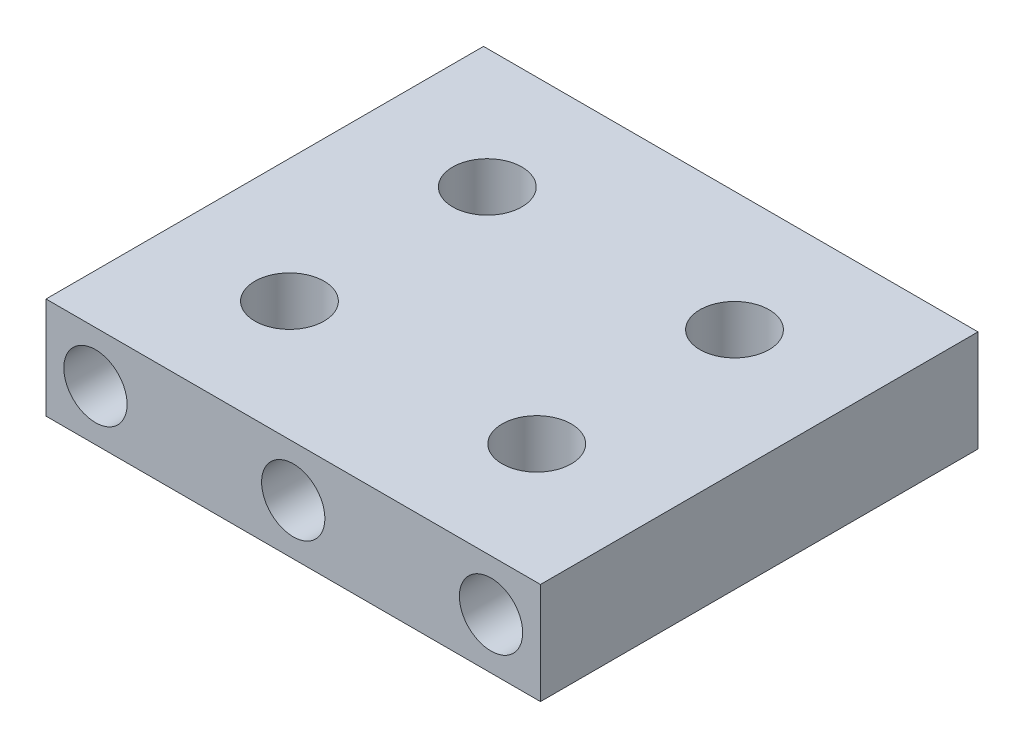
ISO-10303-21;
HEADER;
FILE_DESCRIPTION(('STEP AP214'),'2;1');
FILE_NAME('part.step','',(''),(''),'','','');
FILE_SCHEMA(('AUTOMOTIVE_DESIGN { 1 0 10303 214 1 1 1 1 }'));
ENDSEC;
DATA;
#1=APPLICATION_CONTEXT('core data for automotive mechanical design processes');
#2=APPLICATION_PROTOCOL_DEFINITION('international standard','automotive_design',2000,#1);
#3=PRODUCT_CONTEXT('',#1,'mechanical');
#4=PRODUCT('Part','Part','',(#3));
#5=PRODUCT_RELATED_PRODUCT_CATEGORY('part','',(#4));
#6=PRODUCT_DEFINITION_FORMATION('','',#4);
#7=PRODUCT_DEFINITION_CONTEXT('part definition',#1,'design');
#8=PRODUCT_DEFINITION('design','',#6,#7);
#9=PRODUCT_DEFINITION_SHAPE('','',#8);
#10=(LENGTH_UNIT() NAMED_UNIT(*) SI_UNIT(.MILLI.,.METRE.));
#11=(NAMED_UNIT(*) PLANE_ANGLE_UNIT() SI_UNIT($,.RADIAN.));
#12=(NAMED_UNIT(*) SI_UNIT($,.STERADIAN.) SOLID_ANGLE_UNIT());
#13=UNCERTAINTY_MEASURE_WITH_UNIT(LENGTH_MEASURE(1.E-05),#10,'distance_accuracy_value','');
#14=(GEOMETRIC_REPRESENTATION_CONTEXT(3) GLOBAL_UNCERTAINTY_ASSIGNED_CONTEXT((#13)) GLOBAL_UNIT_ASSIGNED_CONTEXT((#10,
#11,#12)) REPRESENTATION_CONTEXT('',''));
#15=CARTESIAN_POINT('',(0.,0.,0.));
#16=DIRECTION('',(0.,0.,1.));
#17=DIRECTION('',(1.,0.,0.));
#18=AXIS2_PLACEMENT_3D('',#15,#16,#17);
#19=CARTESIAN_POINT('',(12.5,5.13,0.));
#20=DIRECTION('',(1.,0.,0.));
#21=DIRECTION('',(0.,0.,-1.));
#22=AXIS2_PLACEMENT_3D('',#19,#20,#21);
#23=PLANE('',#22);
#24=DIRECTION('',(0.,0.,1.));
#25=VECTOR('',#24,1.);
#26=CARTESIAN_POINT('',(12.5,0.,0.));
#27=LINE('',#26,#25);
#28=CARTESIAN_POINT('',(12.5,0.,-11.06));
#29=VERTEX_POINT('',#28);
#30=CARTESIAN_POINT('',(12.5,0.,11.06));
#31=VERTEX_POINT('',#30);
#32=EDGE_CURVE('E117',#29,#31,#27,.T.);
#33=ORIENTED_EDGE('',*,*,#32,.F.);
#34=DIRECTION('',(0.,-1.,0.));
#35=VECTOR('',#34,1.);
#36=CARTESIAN_POINT('',(12.5,5.13,-11.06));
#37=LINE('',#36,#35);
#38=CARTESIAN_POINT('',(12.5,5.13,-11.06));
#39=VERTEX_POINT('',#38);
#40=EDGE_CURVE('E11',#39,#29,#37,.T.);
#41=ORIENTED_EDGE('',*,*,#40,.F.);
#42=DIRECTION('',(0.,0.,1.));
#43=VECTOR('',#42,1.);
#44=CARTESIAN_POINT('',(12.5,5.13,0.));
#45=LINE('',#44,#43);
#46=CARTESIAN_POINT('',(12.5,5.13,11.06));
#47=VERTEX_POINT('',#46);
#48=EDGE_CURVE('E97',#39,#47,#45,.T.);
#49=ORIENTED_EDGE('',*,*,#48,.T.);
#50=DIRECTION('',(0.,-1.,0.));
#51=VECTOR('',#50,1.);
#52=CARTESIAN_POINT('',(12.5,5.13,11.06));
#53=LINE('',#52,#51);
#54=EDGE_CURVE('E75',#47,#31,#53,.T.);
#55=ORIENTED_EDGE('',*,*,#54,.T.);
#56=EDGE_LOOP('',(#33,#41,#49,#55));
#57=FACE_BOUND('',#56,.T.);
#58=ADVANCED_FACE('F35',(#57),#23,.T.);
#59=CARTESIAN_POINT('',(0.,5.13,-11.06));
#60=DIRECTION('',(0.,0.,-1.));
#61=DIRECTION('',(-1.,0.,0.));
#62=AXIS2_PLACEMENT_3D('',#59,#60,#61);
#63=PLANE('',#62);
#64=CARTESIAN_POINT('',(10.,2.565,-11.06));
#65=DIRECTION('',(0.,0.,-1.));
#66=DIRECTION('',(-1.,0.,0.));
#67=AXIS2_PLACEMENT_3D('',#64,#65,#66);
#68=CIRCLE('',#67,1.6);
#69=CARTESIAN_POINT('',(8.4,2.565,-11.06));
#70=VERTEX_POINT('',#69);
#71=EDGE_CURVE('E264',#70,#70,#68,.F.);
#72=ORIENTED_EDGE('',*,*,#71,.T.);
#73=EDGE_LOOP('',(#72));
#74=FACE_BOUND('',#73,.T.);
#75=CARTESIAN_POINT('',(-10.,2.565,-11.06));
#76=DIRECTION('',(0.,0.,-1.));
#77=DIRECTION('',(-1.,0.,0.));
#78=AXIS2_PLACEMENT_3D('',#75,#76,#77);
#79=CIRCLE('',#78,1.6);
#80=CARTESIAN_POINT('',(-11.6,2.565,-11.06));
#81=VERTEX_POINT('',#80);
#82=EDGE_CURVE('E268',#81,#81,#79,.F.);
#83=ORIENTED_EDGE('',*,*,#82,.T.);
#84=EDGE_LOOP('',(#83));
#85=FACE_BOUND('',#84,.T.);
#86=CARTESIAN_POINT('',(0.,2.565,-11.06));
#87=DIRECTION('',(0.,0.,-1.));
#88=DIRECTION('',(-1.,0.,0.));
#89=AXIS2_PLACEMENT_3D('',#86,#87,#88);
#90=CIRCLE('',#89,1.6);
#91=CARTESIAN_POINT('',(-1.6,2.565,-11.06));
#92=VERTEX_POINT('',#91);
#93=EDGE_CURVE('E276',#92,#92,#90,.F.);
#94=ORIENTED_EDGE('',*,*,#93,.T.);
#95=EDGE_LOOP('',(#94));
#96=FACE_BOUND('',#95,.T.);
#97=DIRECTION('',(1.,0.,0.));
#98=VECTOR('',#97,1.);
#99=CARTESIAN_POINT('',(0.,0.,-11.06));
#100=LINE('',#99,#98);
#101=CARTESIAN_POINT('',(-12.5,0.,-11.06));
#102=VERTEX_POINT('',#101);
#103=EDGE_CURVE('E87',#102,#29,#100,.T.);
#104=ORIENTED_EDGE('',*,*,#103,.F.);
#105=DIRECTION('',(0.,-1.,0.));
#106=VECTOR('',#105,1.);
#107=CARTESIAN_POINT('',(-12.5,5.13,-11.06));
#108=LINE('',#107,#106);
#109=CARTESIAN_POINT('',(-12.5,5.13,-11.06));
#110=VERTEX_POINT('',#109);
#111=EDGE_CURVE('E44',#110,#102,#108,.T.);
#112=ORIENTED_EDGE('',*,*,#111,.F.);
#113=DIRECTION('',(1.,0.,0.));
#114=VECTOR('',#113,1.);
#115=CARTESIAN_POINT('',(0.,5.13,-11.06));
#116=LINE('',#115,#114);
#117=EDGE_CURVE('E85',#110,#39,#116,.T.);
#118=ORIENTED_EDGE('',*,*,#117,.T.);
#119=ORIENTED_EDGE('',*,*,#40,.T.);
#120=EDGE_LOOP('',(#104,#112,#118,#119));
#121=FACE_BOUND('',#120,.T.);
#122=ADVANCED_FACE('F83',(#74,#85,#96,#121),#63,.T.);
#123=CARTESIAN_POINT('',(-12.5,5.13,0.));
#124=DIRECTION('',(1.,0.,0.));
#125=DIRECTION('',(0.,0.,-1.));
#126=AXIS2_PLACEMENT_3D('',#123,#124,#125);
#127=PLANE('',#126);
#128=DIRECTION('',(0.,0.,1.));
#129=VECTOR('',#128,1.);
#130=CARTESIAN_POINT('',(-12.5,0.,0.));
#131=LINE('',#130,#129);
#132=CARTESIAN_POINT('',(-12.5,0.,11.06));
#133=VERTEX_POINT('',#132);
#134=EDGE_CURVE('E120',#102,#133,#131,.T.);
#135=ORIENTED_EDGE('',*,*,#134,.T.);
#136=DIRECTION('',(0.,-1.,0.));
#137=VECTOR('',#136,1.);
#138=CARTESIAN_POINT('',(-12.5,5.13,11.06));
#139=LINE('',#138,#137);
#140=CARTESIAN_POINT('',(-12.5,5.13,11.06));
#141=VERTEX_POINT('',#140);
#142=EDGE_CURVE('E90',#141,#133,#139,.T.);
#143=ORIENTED_EDGE('',*,*,#142,.F.);
#144=DIRECTION('',(0.,0.,1.));
#145=VECTOR('',#144,1.);
#146=CARTESIAN_POINT('',(-12.5,5.13,0.));
#147=LINE('',#146,#145);
#148=EDGE_CURVE('E92',#110,#141,#147,.T.);
#149=ORIENTED_EDGE('',*,*,#148,.F.);
#150=ORIENTED_EDGE('',*,*,#111,.T.);
#151=EDGE_LOOP('',(#135,#143,#149,#150));
#152=FACE_BOUND('',#151,.T.);
#153=ADVANCED_FACE('F93',(#152),#127,.F.);
#154=CARTESIAN_POINT('',(0.,5.13,11.06));
#155=DIRECTION('',(0.,0.,-1.));
#156=DIRECTION('',(-1.,0.,0.));
#157=AXIS2_PLACEMENT_3D('',#154,#155,#156);
#158=PLANE('',#157);
#159=CARTESIAN_POINT('',(10.,2.565,11.06));
#160=DIRECTION('',(0.,0.,1.));
#161=DIRECTION('',(-1.,0.,0.));
#162=AXIS2_PLACEMENT_3D('',#159,#160,#161);
#163=CIRCLE('',#162,1.6);
#164=CARTESIAN_POINT('',(8.4,2.565,11.06));
#165=VERTEX_POINT('',#164);
#166=EDGE_CURVE('E267',#165,#165,#163,.T.);
#167=ORIENTED_EDGE('',*,*,#166,.F.);
#168=EDGE_LOOP('',(#167));
#169=FACE_BOUND('',#168,.T.);
#170=CARTESIAN_POINT('',(-10.,2.565,11.06));
#171=DIRECTION('',(0.,0.,1.));
#172=DIRECTION('',(1.,0.,0.));
#173=AXIS2_PLACEMENT_3D('',#170,#171,#172);
#174=CIRCLE('',#173,1.6);
#175=CARTESIAN_POINT('',(-8.4,2.565,11.06));
#176=VERTEX_POINT('',#175);
#177=EDGE_CURVE('E271',#176,#176,#174,.T.);
#178=ORIENTED_EDGE('',*,*,#177,.F.);
#179=EDGE_LOOP('',(#178));
#180=FACE_BOUND('',#179,.T.);
#181=CARTESIAN_POINT('',(0.,2.565,11.06));
#182=DIRECTION('',(0.,0.,1.));
#183=DIRECTION('',(1.,0.,0.));
#184=AXIS2_PLACEMENT_3D('',#181,#182,#183);
#185=CIRCLE('',#184,1.6);
#186=CARTESIAN_POINT('',(1.6,2.565,11.06));
#187=VERTEX_POINT('',#186);
#188=EDGE_CURVE('E111',#187,#187,#185,.T.);
#189=ORIENTED_EDGE('',*,*,#188,.F.);
#190=EDGE_LOOP('',(#189));
#191=FACE_BOUND('',#190,.T.);
#192=DIRECTION('',(1.,0.,0.));
#193=VECTOR('',#192,1.);
#194=CARTESIAN_POINT('',(0.,0.,11.06));
#195=LINE('',#194,#193);
#196=EDGE_CURVE('E68',#133,#31,#195,.T.);
#197=ORIENTED_EDGE('',*,*,#196,.T.);
#198=ORIENTED_EDGE('',*,*,#54,.F.);
#199=DIRECTION('',(1.,0.,0.));
#200=VECTOR('',#199,1.);
#201=CARTESIAN_POINT('',(0.,5.13,11.06));
#202=LINE('',#201,#200);
#203=EDGE_CURVE('E52',#141,#47,#202,.T.);
#204=ORIENTED_EDGE('',*,*,#203,.F.);
#205=ORIENTED_EDGE('',*,*,#142,.T.);
#206=EDGE_LOOP('',(#197,#198,#204,#205));
#207=FACE_BOUND('',#206,.T.);
#208=ADVANCED_FACE('F129',(#169,#180,#191,#207),#158,.F.);
#209=CARTESIAN_POINT('',(-6.25,5.13,-5.));
#210=DIRECTION('',(0.,-1.,0.));
#211=DIRECTION('',(0.,0.,-1.));
#212=AXIS2_PLACEMENT_3D('',#209,#210,#211);
#213=CYLINDRICAL_SURFACE('',#212,1.75);
#214=CARTESIAN_POINT('',(-6.25,5.13,-5.));
#215=DIRECTION('',(0.,1.,0.));
#216=DIRECTION('',(0.,0.,1.));
#217=AXIS2_PLACEMENT_3D('',#214,#215,#216);
#218=CIRCLE('',#217,1.75);
#219=CARTESIAN_POINT('',(-6.25,5.13,-3.25));
#220=VERTEX_POINT('',#219);
#221=EDGE_CURVE('E99',#220,#220,#218,.T.);
#222=ORIENTED_EDGE('',*,*,#221,.T.);
#223=EDGE_LOOP('',(#222));
#224=FACE_BOUND('',#223,.T.);
#225=CARTESIAN_POINT('',(-6.25,0.,-5.));
#226=DIRECTION('',(0.,1.,0.));
#227=DIRECTION('',(0.,0.,1.));
#228=AXIS2_PLACEMENT_3D('',#225,#226,#227);
#229=CIRCLE('',#228,1.75);
#230=CARTESIAN_POINT('',(-6.25,0.,-3.25));
#231=VERTEX_POINT('',#230);
#232=EDGE_CURVE('E114',#231,#231,#229,.T.);
#233=ORIENTED_EDGE('',*,*,#232,.F.);
#234=EDGE_LOOP('',(#233));
#235=FACE_BOUND('',#234,.T.);
#236=ADVANCED_FACE('F141',(#224,#235),#213,.F.);
#237=CARTESIAN_POINT('',(-6.25,5.13,5.));
#238=DIRECTION('',(0.,-1.,0.));
#239=DIRECTION('',(0.,0.,-1.));
#240=AXIS2_PLACEMENT_3D('',#237,#238,#239);
#241=CYLINDRICAL_SURFACE('',#240,1.75);
#242=CARTESIAN_POINT('',(-6.25,5.13,5.));
#243=DIRECTION('',(0.,1.,0.));
#244=DIRECTION('',(0.,0.,1.));
#245=AXIS2_PLACEMENT_3D('',#242,#243,#244);
#246=CIRCLE('',#245,1.75);
#247=CARTESIAN_POINT('',(-6.25,5.13,6.75));
#248=VERTEX_POINT('',#247);
#249=EDGE_CURVE('E155',#248,#248,#246,.T.);
#250=ORIENTED_EDGE('',*,*,#249,.T.);
#251=EDGE_LOOP('',(#250));
#252=FACE_BOUND('',#251,.T.);
#253=CARTESIAN_POINT('',(-6.25,0.,5.));
#254=DIRECTION('',(0.,1.,0.));
#255=DIRECTION('',(0.,0.,1.));
#256=AXIS2_PLACEMENT_3D('',#253,#254,#255);
#257=CIRCLE('',#256,1.75);
#258=CARTESIAN_POINT('',(-6.25,0.,6.75));
#259=VERTEX_POINT('',#258);
#260=EDGE_CURVE('E110',#259,#259,#257,.T.);
#261=ORIENTED_EDGE('',*,*,#260,.F.);
#262=EDGE_LOOP('',(#261));
#263=FACE_BOUND('',#262,.T.);
#264=ADVANCED_FACE('F143',(#252,#263),#241,.F.);
#265=CARTESIAN_POINT('',(6.25,5.13,4.99999999999999));
#266=DIRECTION('',(0.,-1.,0.));
#267=DIRECTION('',(0.,0.,-1.));
#268=AXIS2_PLACEMENT_3D('',#265,#266,#267);
#269=CYLINDRICAL_SURFACE('',#268,1.75);
#270=CARTESIAN_POINT('',(6.25,5.13,4.99999999999999));
#271=DIRECTION('',(0.,1.,0.));
#272=DIRECTION('',(0.,0.,1.));
#273=AXIS2_PLACEMENT_3D('',#270,#271,#272);
#274=CIRCLE('',#273,1.75);
#275=CARTESIAN_POINT('',(6.25,5.13,6.74999999999999));
#276=VERTEX_POINT('',#275);
#277=EDGE_CURVE('E126',#276,#276,#274,.F.);
#278=ORIENTED_EDGE('',*,*,#277,.F.);
#279=EDGE_LOOP('',(#278));
#280=FACE_BOUND('',#279,.T.);
#281=CARTESIAN_POINT('',(6.25,0.,4.99999999999999));
#282=DIRECTION('',(0.,1.,0.));
#283=DIRECTION('',(0.,0.,1.));
#284=AXIS2_PLACEMENT_3D('',#281,#282,#283);
#285=CIRCLE('',#284,1.75);
#286=CARTESIAN_POINT('',(6.25,0.,6.74999999999999));
#287=VERTEX_POINT('',#286);
#288=EDGE_CURVE('E107',#287,#287,#285,.F.);
#289=ORIENTED_EDGE('',*,*,#288,.T.);
#290=EDGE_LOOP('',(#289));
#291=FACE_BOUND('',#290,.T.);
#292=ADVANCED_FACE('F37',(#280,#291),#269,.F.);
#293=CARTESIAN_POINT('',(6.25,5.13,-5.));
#294=DIRECTION('',(0.,-1.,0.));
#295=DIRECTION('',(0.,0.,-1.));
#296=AXIS2_PLACEMENT_3D('',#293,#294,#295);
#297=CYLINDRICAL_SURFACE('',#296,1.75);
#298=CARTESIAN_POINT('',(6.25,5.13,-5.));
#299=DIRECTION('',(0.,1.,0.));
#300=DIRECTION('',(0.,0.,1.));
#301=AXIS2_PLACEMENT_3D('',#298,#299,#300);
#302=CIRCLE('',#301,1.75);
#303=CARTESIAN_POINT('',(6.25,5.13,-3.25));
#304=VERTEX_POINT('',#303);
#305=EDGE_CURVE('E104',#304,#304,#302,.F.);
#306=ORIENTED_EDGE('',*,*,#305,.F.);
#307=EDGE_LOOP('',(#306));
#308=FACE_BOUND('',#307,.T.);
#309=CARTESIAN_POINT('',(6.25,0.,-5.));
#310=DIRECTION('',(0.,1.,0.));
#311=DIRECTION('',(0.,0.,1.));
#312=AXIS2_PLACEMENT_3D('',#309,#310,#311);
#313=CIRCLE('',#312,1.75);
#314=CARTESIAN_POINT('',(6.25,0.,-3.25));
#315=VERTEX_POINT('',#314);
#316=EDGE_CURVE('E123',#315,#315,#313,.F.);
#317=ORIENTED_EDGE('',*,*,#316,.T.);
#318=EDGE_LOOP('',(#317));
#319=FACE_BOUND('',#318,.T.);
#320=ADVANCED_FACE('F150',(#308,#319),#297,.F.);
#321=CARTESIAN_POINT('',(0.,5.13,0.));
#322=DIRECTION('',(0.,1.,0.));
#323=DIRECTION('',(0.,0.,1.));
#324=AXIS2_PLACEMENT_3D('',#321,#322,#323);
#325=PLANE('',#324);
#326=ORIENTED_EDGE('',*,*,#277,.T.);
#327=EDGE_LOOP('',(#326));
#328=FACE_BOUND('',#327,.T.);
#329=ORIENTED_EDGE('',*,*,#249,.F.);
#330=EDGE_LOOP('',(#329));
#331=FACE_BOUND('',#330,.T.);
#332=ORIENTED_EDGE('',*,*,#221,.F.);
#333=EDGE_LOOP('',(#332));
#334=FACE_BOUND('',#333,.T.);
#335=ORIENTED_EDGE('',*,*,#48,.F.);
#336=ORIENTED_EDGE('',*,*,#117,.F.);
#337=ORIENTED_EDGE('',*,*,#148,.T.);
#338=ORIENTED_EDGE('',*,*,#203,.T.);
#339=EDGE_LOOP('',(#335,#336,#337,#338));
#340=FACE_BOUND('',#339,.T.);
#341=ORIENTED_EDGE('',*,*,#305,.T.);
#342=EDGE_LOOP('',(#341));
#343=FACE_BOUND('',#342,.T.);
#344=ADVANCED_FACE('F95',(#328,#331,#334,#340,#343),#325,.T.);
#345=CARTESIAN_POINT('',(0.,0.,0.));
#346=DIRECTION('',(0.,1.,0.));
#347=DIRECTION('',(0.,0.,1.));
#348=AXIS2_PLACEMENT_3D('',#345,#346,#347);
#349=PLANE('',#348);
#350=ORIENTED_EDGE('',*,*,#288,.F.);
#351=EDGE_LOOP('',(#350));
#352=FACE_BOUND('',#351,.T.);
#353=ORIENTED_EDGE('',*,*,#260,.T.);
#354=EDGE_LOOP('',(#353));
#355=FACE_BOUND('',#354,.T.);
#356=ORIENTED_EDGE('',*,*,#232,.T.);
#357=EDGE_LOOP('',(#356));
#358=FACE_BOUND('',#357,.T.);
#359=ORIENTED_EDGE('',*,*,#32,.T.);
#360=ORIENTED_EDGE('',*,*,#196,.F.);
#361=ORIENTED_EDGE('',*,*,#134,.F.);
#362=ORIENTED_EDGE('',*,*,#103,.T.);
#363=EDGE_LOOP('',(#359,#360,#361,#362));
#364=FACE_BOUND('',#363,.T.);
#365=ORIENTED_EDGE('',*,*,#316,.F.);
#366=EDGE_LOOP('',(#365));
#367=FACE_BOUND('',#366,.T.);
#368=ADVANCED_FACE('F130',(#352,#355,#358,#364,#367),#349,.F.);
#369=CARTESIAN_POINT('',(0.,2.565,-11.061));
#370=DIRECTION('',(0.,0.,1.));
#371=DIRECTION('',(1.,0.,0.));
#372=AXIS2_PLACEMENT_3D('',#369,#370,#371);
#373=CYLINDRICAL_SURFACE('',#372,1.6);
#374=ORIENTED_EDGE('',*,*,#93,.F.);
#375=EDGE_LOOP('',(#374));
#376=FACE_BOUND('',#375,.T.);
#377=ORIENTED_EDGE('',*,*,#188,.T.);
#378=EDGE_LOOP('',(#377));
#379=FACE_BOUND('',#378,.T.);
#380=ADVANCED_FACE('F160',(#376,#379),#373,.F.);
#381=CARTESIAN_POINT('',(-10.,2.565,-11.061));
#382=DIRECTION('',(0.,0.,1.));
#383=DIRECTION('',(1.,0.,0.));
#384=AXIS2_PLACEMENT_3D('',#381,#382,#383);
#385=CYLINDRICAL_SURFACE('',#384,1.6);
#386=ORIENTED_EDGE('',*,*,#82,.F.);
#387=EDGE_LOOP('',(#386));
#388=FACE_BOUND('',#387,.T.);
#389=ORIENTED_EDGE('',*,*,#177,.T.);
#390=EDGE_LOOP('',(#389));
#391=FACE_BOUND('',#390,.T.);
#392=ADVANCED_FACE('F169',(#388,#391),#385,.F.);
#393=CARTESIAN_POINT('',(10.,2.565,-11.061));
#394=DIRECTION('',(0.,0.,1.));
#395=DIRECTION('',(1.,0.,0.));
#396=AXIS2_PLACEMENT_3D('',#393,#394,#395);
#397=CYLINDRICAL_SURFACE('',#396,1.6);
#398=ORIENTED_EDGE('',*,*,#71,.F.);
#399=EDGE_LOOP('',(#398));
#400=FACE_BOUND('',#399,.T.);
#401=ORIENTED_EDGE('',*,*,#166,.T.);
#402=EDGE_LOOP('',(#401));
#403=FACE_BOUND('',#402,.T.);
#404=ADVANCED_FACE('F247',(#400,#403),#397,.F.);
#405=CLOSED_SHELL('',(#58,#122,#153,#208,#236,#264,#292,#320,#344,#368,#380,#392,#404));
#406=MANIFOLD_SOLID_BREP('B2',#405);
#407=ADVANCED_BREP_SHAPE_REPRESENTATION('',(#18,#406),#14);
#408=SHAPE_DEFINITION_REPRESENTATION(#9,#407);
ENDSEC;
END-ISO-10303-21;
